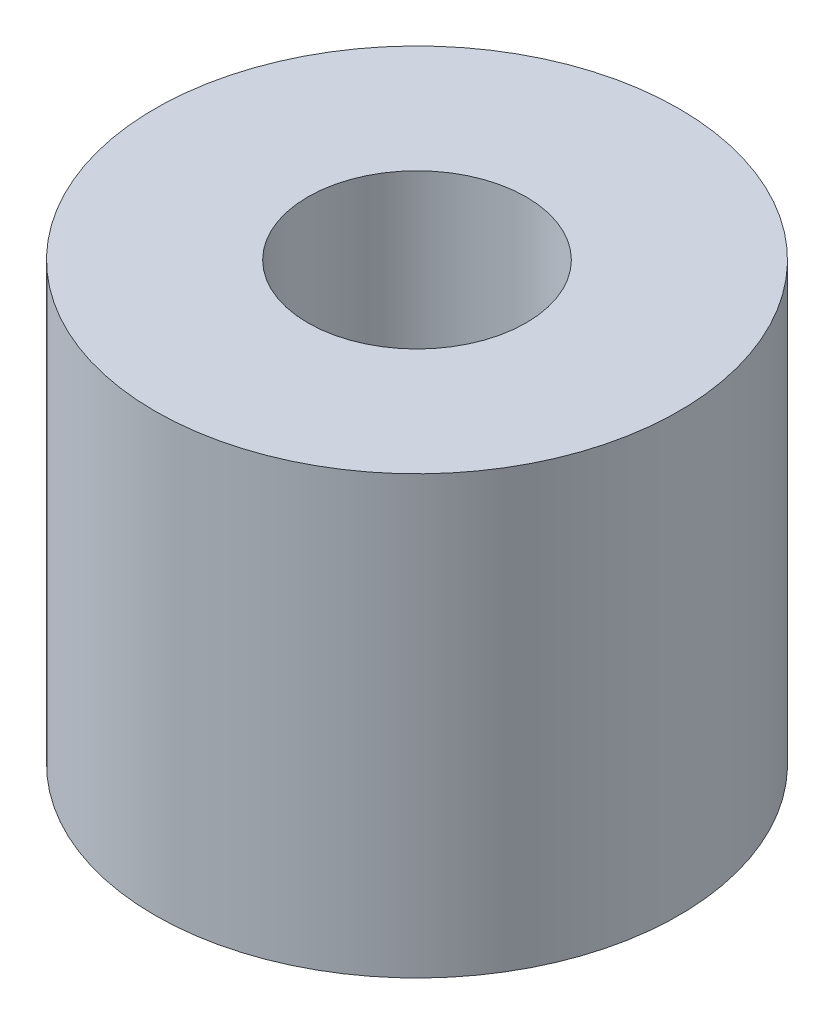
ISO-10303-21;
HEADER;
FILE_DESCRIPTION(('STEP AP214'),'2;1');
FILE_NAME('part.step','',(''),(''),'','','');
FILE_SCHEMA(('AUTOMOTIVE_DESIGN { 1 0 10303 214 1 1 1 1 }'));
ENDSEC;
DATA;
#1=APPLICATION_CONTEXT('core data for automotive mechanical design processes');
#2=APPLICATION_PROTOCOL_DEFINITION('international standard','automotive_design',2000,#1);
#3=PRODUCT_CONTEXT('',#1,'mechanical');
#4=PRODUCT('Part','Part','',(#3));
#5=PRODUCT_RELATED_PRODUCT_CATEGORY('part','',(#4));
#6=PRODUCT_DEFINITION_FORMATION('','',#4);
#7=PRODUCT_DEFINITION_CONTEXT('part definition',#1,'design');
#8=PRODUCT_DEFINITION('design','',#6,#7);
#9=PRODUCT_DEFINITION_SHAPE('','',#8);
#10=(LENGTH_UNIT() NAMED_UNIT(*) SI_UNIT(.MILLI.,.METRE.));
#11=(NAMED_UNIT(*) PLANE_ANGLE_UNIT() SI_UNIT($,.RADIAN.));
#12=(NAMED_UNIT(*) SI_UNIT($,.STERADIAN.) SOLID_ANGLE_UNIT());
#13=UNCERTAINTY_MEASURE_WITH_UNIT(LENGTH_MEASURE(1.E-05),#10,'distance_accuracy_value','');
#14=(GEOMETRIC_REPRESENTATION_CONTEXT(3) GLOBAL_UNCERTAINTY_ASSIGNED_CONTEXT((#13)) GLOBAL_UNIT_ASSIGNED_CONTEXT((#10,
#11,#12)) REPRESENTATION_CONTEXT('',''));
#15=CARTESIAN_POINT('',(0.,0.,0.));
#16=DIRECTION('',(0.,0.,1.));
#17=DIRECTION('',(1.,0.,0.));
#18=AXIS2_PLACEMENT_3D('',#15,#16,#17);
#19=CARTESIAN_POINT('',(0.,10.,0.));
#20=DIRECTION('',(0.,-1.,0.));
#21=DIRECTION('',(0.,0.,-1.));
#22=AXIS2_PLACEMENT_3D('',#19,#20,#21);
#23=CYLINDRICAL_SURFACE('',#22,25.);
#24=CARTESIAN_POINT('',(0.,10.,0.));
#25=DIRECTION('',(0.,1.,0.));
#26=DIRECTION('',(0.,0.,1.));
#27=AXIS2_PLACEMENT_3D('',#24,#25,#26);
#28=CIRCLE('',#27,25.);
#29=CARTESIAN_POINT('',(0.,10.,25.));
#30=VERTEX_POINT('',#29);
#31=EDGE_CURVE('E10',#30,#30,#28,.T.);
#32=ORIENTED_EDGE('',*,*,#31,.F.);
#33=EDGE_LOOP('',(#32));
#34=FACE_BOUND('',#33,.T.);
#35=CARTESIAN_POINT('',(0.,0.,0.));
#36=DIRECTION('',(0.,1.,0.));
#37=DIRECTION('',(0.,0.,1.));
#38=AXIS2_PLACEMENT_3D('',#35,#36,#37);
#39=CIRCLE('',#38,25.);
#40=CARTESIAN_POINT('',(0.,0.,25.));
#41=VERTEX_POINT('',#40);
#42=EDGE_CURVE('E34',#41,#41,#39,.T.);
#43=ORIENTED_EDGE('',*,*,#42,.T.);
#44=EDGE_LOOP('',(#43));
#45=FACE_BOUND('',#44,.T.);
#46=ADVANCED_FACE('F31',(#34,#45),#23,.T.);
#47=CARTESIAN_POINT('',(0.,0.,0.));
#48=DIRECTION('',(0.,1.,0.));
#49=DIRECTION('',(0.,0.,1.));
#50=AXIS2_PLACEMENT_3D('',#47,#48,#49);
#51=PLANE('',#50);
#52=ORIENTED_EDGE('',*,*,#42,.F.);
#53=EDGE_LOOP('',(#52));
#54=FACE_BOUND('',#53,.T.);
#55=ADVANCED_FACE('F73',(#54),#51,.F.);
#56=CARTESIAN_POINT('',(0.,110.,0.));
#57=DIRECTION('',(0.,-1.,0.));
#58=DIRECTION('',(0.,0.,-1.));
#59=AXIS2_PLACEMENT_3D('',#56,#57,#58);
#60=CYLINDRICAL_SURFACE('',#59,60.);
#61=CARTESIAN_POINT('',(0.,110.,0.));
#62=DIRECTION('',(0.,1.,0.));
#63=DIRECTION('',(0.,0.,1.));
#64=AXIS2_PLACEMENT_3D('',#61,#62,#63);
#65=CIRCLE('',#64,60.);
#66=CARTESIAN_POINT('',(0.,110.,60.));
#67=VERTEX_POINT('',#66);
#68=EDGE_CURVE('E41',#67,#67,#65,.T.);
#69=ORIENTED_EDGE('',*,*,#68,.F.);
#70=EDGE_LOOP('',(#69));
#71=FACE_BOUND('',#70,.T.);
#72=CARTESIAN_POINT('',(0.,10.,0.));
#73=DIRECTION('',(0.,1.,0.));
#74=DIRECTION('',(0.,0.,1.));
#75=AXIS2_PLACEMENT_3D('',#72,#73,#74);
#76=CIRCLE('',#75,60.);
#77=CARTESIAN_POINT('',(0.,10.,60.));
#78=VERTEX_POINT('',#77);
#79=EDGE_CURVE('E43',#78,#78,#76,.T.);
#80=ORIENTED_EDGE('',*,*,#79,.T.);
#81=EDGE_LOOP('',(#80));
#82=FACE_BOUND('',#81,.T.);
#83=ADVANCED_FACE('F67',(#71,#82),#60,.T.);
#84=CARTESIAN_POINT('',(0.,110.,0.));
#85=DIRECTION('',(0.,1.,0.));
#86=DIRECTION('',(0.,0.,1.));
#87=AXIS2_PLACEMENT_3D('',#84,#85,#86);
#88=PLANE('',#87);
#89=CARTESIAN_POINT('',(0.,110.,0.));
#90=DIRECTION('',(0.,1.,0.));
#91=DIRECTION('',(0.,0.,1.));
#92=AXIS2_PLACEMENT_3D('',#89,#90,#91);
#93=CIRCLE('',#92,25.);
#94=CARTESIAN_POINT('',(0.,110.,25.));
#95=VERTEX_POINT('',#94);
#96=EDGE_CURVE('E49',#95,#95,#93,.T.);
#97=ORIENTED_EDGE('',*,*,#96,.F.);
#98=EDGE_LOOP('',(#97));
#99=FACE_BOUND('',#98,.T.);
#100=ORIENTED_EDGE('',*,*,#68,.T.);
#101=EDGE_LOOP('',(#100));
#102=FACE_BOUND('',#101,.T.);
#103=ADVANCED_FACE('F64',(#99,#102),#88,.T.);
#104=CARTESIAN_POINT('',(0.,10.,0.));
#105=DIRECTION('',(0.,1.,0.));
#106=DIRECTION('',(0.,0.,1.));
#107=AXIS2_PLACEMENT_3D('',#104,#105,#106);
#108=PLANE('',#107);
#109=ORIENTED_EDGE('',*,*,#31,.T.);
#110=EDGE_LOOP('',(#109));
#111=FACE_BOUND('',#110,.T.);
#112=ORIENTED_EDGE('',*,*,#79,.F.);
#113=EDGE_LOOP('',(#112));
#114=FACE_BOUND('',#113,.T.);
#115=ADVANCED_FACE('F60',(#111,#114),#108,.F.);
#116=CARTESIAN_POINT('',(0.,60.,0.));
#117=DIRECTION('',(0.,1.,0.));
#118=DIRECTION('',(0.,0.,1.));
#119=AXIS2_PLACEMENT_3D('',#116,#117,#118);
#120=CYLINDRICAL_SURFACE('',#119,25.);
#121=CARTESIAN_POINT('',(0.,60.,0.));
#122=DIRECTION('',(0.,1.,0.));
#123=DIRECTION('',(0.,0.,1.));
#124=AXIS2_PLACEMENT_3D('',#121,#122,#123);
#125=CIRCLE('',#124,25.);
#126=CARTESIAN_POINT('',(0.,60.,25.));
#127=VERTEX_POINT('',#126);
#128=EDGE_CURVE('E46',#127,#127,#125,.T.);
#129=ORIENTED_EDGE('',*,*,#128,.F.);
#130=EDGE_LOOP('',(#129));
#131=FACE_BOUND('',#130,.T.);
#132=ORIENTED_EDGE('',*,*,#96,.T.);
#133=EDGE_LOOP('',(#132));
#134=FACE_BOUND('',#133,.T.);
#135=ADVANCED_FACE('F57',(#131,#134),#120,.F.);
#136=CARTESIAN_POINT('',(0.,60.,0.));
#137=DIRECTION('',(0.,1.,0.));
#138=DIRECTION('',(0.,0.,1.));
#139=AXIS2_PLACEMENT_3D('',#136,#137,#138);
#140=PLANE('',#139);
#141=ORIENTED_EDGE('',*,*,#128,.T.);
#142=EDGE_LOOP('',(#141));
#143=FACE_BOUND('',#142,.T.);
#144=ADVANCED_FACE('F55',(#143),#140,.T.);
#145=CLOSED_SHELL('',(#46,#55,#83,#103,#115,#135,#144));
#146=MANIFOLD_SOLID_BREP('B2',#145);
#147=ADVANCED_BREP_SHAPE_REPRESENTATION('',(#18,#146),#14);
#148=SHAPE_DEFINITION_REPRESENTATION(#9,#147);
ENDSEC;
END-ISO-10303-21;
